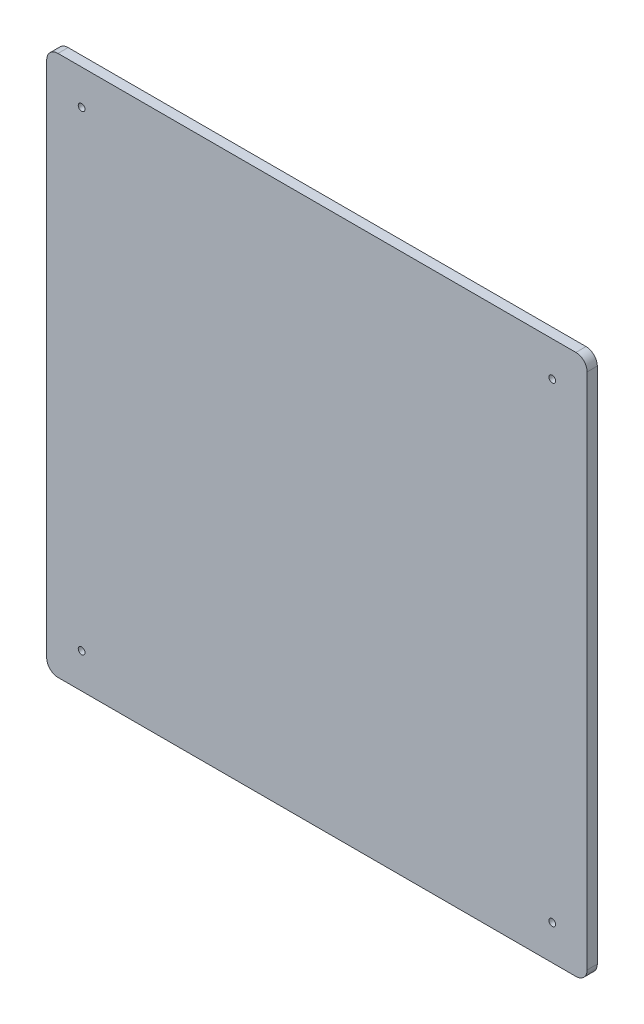
ISO-10303-21;
HEADER;
FILE_DESCRIPTION(('STEP AP214'),'2;1');
FILE_NAME('part.step','',(''),(''),'','','');
FILE_SCHEMA(('AUTOMOTIVE_DESIGN { 1 0 10303 214 1 1 1 1 }'));
ENDSEC;
DATA;
#1=APPLICATION_CONTEXT('core data for automotive mechanical design processes');
#2=APPLICATION_PROTOCOL_DEFINITION('international standard','automotive_design',2000,#1);
#3=PRODUCT_CONTEXT('',#1,'mechanical');
#4=PRODUCT('Part','Part','',(#3));
#5=PRODUCT_RELATED_PRODUCT_CATEGORY('part','',(#4));
#6=PRODUCT_DEFINITION_FORMATION('','',#4);
#7=PRODUCT_DEFINITION_CONTEXT('part definition',#1,'design');
#8=PRODUCT_DEFINITION('design','',#6,#7);
#9=PRODUCT_DEFINITION_SHAPE('','',#8);
#10=(LENGTH_UNIT() NAMED_UNIT(*) SI_UNIT(.MILLI.,.METRE.));
#11=(NAMED_UNIT(*) PLANE_ANGLE_UNIT() SI_UNIT($,.RADIAN.));
#12=(NAMED_UNIT(*) SI_UNIT($,.STERADIAN.) SOLID_ANGLE_UNIT());
#13=UNCERTAINTY_MEASURE_WITH_UNIT(LENGTH_MEASURE(1.E-05),#10,'distance_accuracy_value','');
#14=(GEOMETRIC_REPRESENTATION_CONTEXT(3) GLOBAL_UNCERTAINTY_ASSIGNED_CONTEXT((#13)) GLOBAL_UNIT_ASSIGNED_CONTEXT((#10,
#11,#12)) REPRESENTATION_CONTEXT('',''));
#15=CARTESIAN_POINT('',(0.,0.,0.));
#16=DIRECTION('',(0.,0.,1.));
#17=DIRECTION('',(1.,0.,0.));
#18=AXIS2_PLACEMENT_3D('',#15,#16,#17);
#19=CARTESIAN_POINT('',(120.,-120.,4.5));
#20=DIRECTION('',(-1.,0.,0.));
#21=DIRECTION('',(0.,-1.,0.));
#22=AXIS2_PLACEMENT_3D('',#19,#20,#21);
#23=PLANE('',#22);
#24=DIRECTION('',(0.,1.,0.));
#25=VECTOR('',#24,1.);
#26=CARTESIAN_POINT('',(120.,-120.,0.));
#27=LINE('',#26,#25);
#28=CARTESIAN_POINT('',(120.,-115.,0.));
#29=VERTEX_POINT('',#28);
#30=CARTESIAN_POINT('',(120.,115.,0.));
#31=VERTEX_POINT('',#30);
#32=EDGE_CURVE('E158',#29,#31,#27,.T.);
#33=ORIENTED_EDGE('',*,*,#32,.T.);
#34=DIRECTION('',(0.,0.,-1.));
#35=VECTOR('',#34,1.);
#36=CARTESIAN_POINT('',(120.,115.,4.5));
#37=LINE('',#36,#35);
#38=CARTESIAN_POINT('',(120.,115.,4.5));
#39=VERTEX_POINT('',#38);
#40=EDGE_CURVE('E11',#31,#39,#37,.F.);
#41=ORIENTED_EDGE('',*,*,#40,.T.);
#42=DIRECTION('',(0.,1.,0.));
#43=VECTOR('',#42,1.);
#44=CARTESIAN_POINT('',(120.,-120.,4.5));
#45=LINE('',#44,#43);
#46=CARTESIAN_POINT('',(120.,-115.,4.5));
#47=VERTEX_POINT('',#46);
#48=EDGE_CURVE('E126',#47,#39,#45,.T.);
#49=ORIENTED_EDGE('',*,*,#48,.F.);
#50=DIRECTION('',(0.,0.,-1.));
#51=VECTOR('',#50,1.);
#52=CARTESIAN_POINT('',(120.,-115.,4.5));
#53=LINE('',#52,#51);
#54=EDGE_CURVE('E42',#47,#29,#53,.T.);
#55=ORIENTED_EDGE('',*,*,#54,.T.);
#56=EDGE_LOOP('',(#33,#41,#49,#55));
#57=FACE_BOUND('',#56,.T.);
#58=ADVANCED_FACE('F34',(#57),#23,.F.);
#59=CARTESIAN_POINT('',(-120.,120.,4.5));
#60=DIRECTION('',(0.,-1.,0.));
#61=DIRECTION('',(1.,0.,0.));
#62=AXIS2_PLACEMENT_3D('',#59,#60,#61);
#63=PLANE('',#62);
#64=DIRECTION('',(-1.,0.,0.));
#65=VECTOR('',#64,1.);
#66=CARTESIAN_POINT('',(-120.,120.,0.));
#67=LINE('',#66,#65);
#68=CARTESIAN_POINT('',(115.,120.,0.));
#69=VERTEX_POINT('',#68);
#70=CARTESIAN_POINT('',(-115.,120.,0.));
#71=VERTEX_POINT('',#70);
#72=EDGE_CURVE('E131',#69,#71,#67,.T.);
#73=ORIENTED_EDGE('',*,*,#72,.T.);
#74=DIRECTION('',(0.,0.,-1.));
#75=VECTOR('',#74,1.);
#76=CARTESIAN_POINT('',(-115.,120.,4.5));
#77=LINE('',#76,#75);
#78=CARTESIAN_POINT('',(-115.,120.,4.5));
#79=VERTEX_POINT('',#78);
#80=EDGE_CURVE('E49',#71,#79,#77,.F.);
#81=ORIENTED_EDGE('',*,*,#80,.T.);
#82=DIRECTION('',(-1.,0.,0.));
#83=VECTOR('',#82,1.);
#84=CARTESIAN_POINT('',(-120.,120.,4.5));
#85=LINE('',#84,#83);
#86=CARTESIAN_POINT('',(115.,120.,4.5));
#87=VERTEX_POINT('',#86);
#88=EDGE_CURVE('E129',#87,#79,#85,.T.);
#89=ORIENTED_EDGE('',*,*,#88,.F.);
#90=DIRECTION('',(0.,0.,-1.));
#91=VECTOR('',#90,1.);
#92=CARTESIAN_POINT('',(115.,120.,4.5));
#93=LINE('',#92,#91);
#94=EDGE_CURVE('E150',#87,#69,#93,.T.);
#95=ORIENTED_EDGE('',*,*,#94,.T.);
#96=EDGE_LOOP('',(#73,#81,#89,#95));
#97=FACE_BOUND('',#96,.T.);
#98=ADVANCED_FACE('F221',(#97),#63,.F.);
#99=CARTESIAN_POINT('',(-120.,-120.,4.5));
#100=DIRECTION('',(1.,0.,0.));
#101=DIRECTION('',(0.,1.,0.));
#102=AXIS2_PLACEMENT_3D('',#99,#100,#101);
#103=PLANE('',#102);
#104=DIRECTION('',(0.,-1.,0.));
#105=VECTOR('',#104,1.);
#106=CARTESIAN_POINT('',(-120.,-120.,0.));
#107=LINE('',#106,#105);
#108=CARTESIAN_POINT('',(-120.,115.,0.));
#109=VERTEX_POINT('',#108);
#110=CARTESIAN_POINT('',(-120.,-115.,0.));
#111=VERTEX_POINT('',#110);
#112=EDGE_CURVE('E127',#109,#111,#107,.T.);
#113=ORIENTED_EDGE('',*,*,#112,.T.);
#114=DIRECTION('',(0.,0.,-1.));
#115=VECTOR('',#114,1.);
#116=CARTESIAN_POINT('',(-120.,-115.,4.5));
#117=LINE('',#116,#115);
#118=CARTESIAN_POINT('',(-120.,-115.,4.5));
#119=VERTEX_POINT('',#118);
#120=EDGE_CURVE('E105',#111,#119,#117,.F.);
#121=ORIENTED_EDGE('',*,*,#120,.T.);
#122=DIRECTION('',(0.,-1.,0.));
#123=VECTOR('',#122,1.);
#124=CARTESIAN_POINT('',(-120.,-120.,4.5));
#125=LINE('',#124,#123);
#126=CARTESIAN_POINT('',(-120.,115.,4.5));
#127=VERTEX_POINT('',#126);
#128=EDGE_CURVE('E170',#127,#119,#125,.T.);
#129=ORIENTED_EDGE('',*,*,#128,.F.);
#130=DIRECTION('',(0.,0.,-1.));
#131=VECTOR('',#130,1.);
#132=CARTESIAN_POINT('',(-120.,115.,4.5));
#133=LINE('',#132,#131);
#134=EDGE_CURVE('E110',#127,#109,#133,.T.);
#135=ORIENTED_EDGE('',*,*,#134,.T.);
#136=EDGE_LOOP('',(#113,#121,#129,#135));
#137=FACE_BOUND('',#136,.T.);
#138=ADVANCED_FACE('F218',(#137),#103,.F.);
#139=CARTESIAN_POINT('',(-120.,-120.,4.5));
#140=DIRECTION('',(0.,1.,0.));
#141=DIRECTION('',(-1.,0.,0.));
#142=AXIS2_PLACEMENT_3D('',#139,#140,#141);
#143=PLANE('',#142);
#144=DIRECTION('',(1.,0.,0.));
#145=VECTOR('',#144,1.);
#146=CARTESIAN_POINT('',(-120.,-120.,4.5));
#147=LINE('',#146,#145);
#148=CARTESIAN_POINT('',(-115.,-120.,4.5));
#149=VERTEX_POINT('',#148);
#150=CARTESIAN_POINT('',(115.,-120.,4.5));
#151=VERTEX_POINT('',#150);
#152=EDGE_CURVE('E120',#149,#151,#147,.T.);
#153=ORIENTED_EDGE('',*,*,#152,.F.);
#154=DIRECTION('',(0.,0.,-1.));
#155=VECTOR('',#154,1.);
#156=CARTESIAN_POINT('',(-115.,-120.,4.5));
#157=LINE('',#156,#155);
#158=CARTESIAN_POINT('',(-115.,-120.,0.));
#159=VERTEX_POINT('',#158);
#160=EDGE_CURVE('E104',#149,#159,#157,.T.);
#161=ORIENTED_EDGE('',*,*,#160,.T.);
#162=DIRECTION('',(1.,0.,0.));
#163=VECTOR('',#162,1.);
#164=CARTESIAN_POINT('',(-120.,-120.,0.));
#165=LINE('',#164,#163);
#166=CARTESIAN_POINT('',(115.,-120.,0.));
#167=VERTEX_POINT('',#166);
#168=EDGE_CURVE('E117',#159,#167,#165,.T.);
#169=ORIENTED_EDGE('',*,*,#168,.T.);
#170=DIRECTION('',(0.,0.,-1.));
#171=VECTOR('',#170,1.);
#172=CARTESIAN_POINT('',(115.,-120.,4.5));
#173=LINE('',#172,#171);
#174=EDGE_CURVE('E122',#167,#151,#173,.F.);
#175=ORIENTED_EDGE('',*,*,#174,.T.);
#176=EDGE_LOOP('',(#153,#161,#169,#175));
#177=FACE_BOUND('',#176,.T.);
#178=ADVANCED_FACE('F116',(#177),#143,.F.);
#179=CARTESIAN_POINT('',(0.,0.,4.5));
#180=DIRECTION('',(0.,0.,-1.));
#181=DIRECTION('',(-1.,0.,0.));
#182=AXIS2_PLACEMENT_3D('',#179,#180,#181);
#183=PLANE('',#182);
#184=CARTESIAN_POINT('',(-104.5,104.5,4.5));
#185=DIRECTION('',(0.,0.,-1.));
#186=DIRECTION('',(-1.,0.,0.));
#187=AXIS2_PLACEMENT_3D('',#184,#185,#186);
#188=CIRCLE('',#187,1.5);
#189=CARTESIAN_POINT('',(-106.,104.5,4.5));
#190=VERTEX_POINT('',#189);
#191=EDGE_CURVE('E176',#190,#190,#188,.F.);
#192=ORIENTED_EDGE('',*,*,#191,.F.);
#193=EDGE_LOOP('',(#192));
#194=FACE_BOUND('',#193,.T.);
#195=CARTESIAN_POINT('',(104.5,-104.5,4.5));
#196=DIRECTION('',(0.,0.,-1.));
#197=DIRECTION('',(-1.,0.,0.));
#198=AXIS2_PLACEMENT_3D('',#195,#196,#197);
#199=CIRCLE('',#198,1.5);
#200=CARTESIAN_POINT('',(103.,-104.5,4.5));
#201=VERTEX_POINT('',#200);
#202=EDGE_CURVE('E177',#201,#201,#199,.F.);
#203=ORIENTED_EDGE('',*,*,#202,.F.);
#204=EDGE_LOOP('',(#203));
#205=FACE_BOUND('',#204,.T.);
#206=CARTESIAN_POINT('',(-104.5,-104.5,4.5));
#207=DIRECTION('',(0.,0.,-1.));
#208=DIRECTION('',(-1.,0.,0.));
#209=AXIS2_PLACEMENT_3D('',#206,#207,#208);
#210=CIRCLE('',#209,1.5);
#211=CARTESIAN_POINT('',(-106.,-104.5,4.5));
#212=VERTEX_POINT('',#211);
#213=EDGE_CURVE('E184',#212,#212,#210,.F.);
#214=ORIENTED_EDGE('',*,*,#213,.F.);
#215=EDGE_LOOP('',(#214));
#216=FACE_BOUND('',#215,.T.);
#217=CARTESIAN_POINT('',(104.5,104.5,4.5));
#218=DIRECTION('',(0.,0.,-1.));
#219=DIRECTION('',(-1.,0.,0.));
#220=AXIS2_PLACEMENT_3D('',#217,#218,#219);
#221=CIRCLE('',#220,1.5);
#222=CARTESIAN_POINT('',(103.,104.5,4.5));
#223=VERTEX_POINT('',#222);
#224=EDGE_CURVE('E163',#223,#223,#221,.F.);
#225=ORIENTED_EDGE('',*,*,#224,.F.);
#226=EDGE_LOOP('',(#225));
#227=FACE_BOUND('',#226,.T.);
#228=ORIENTED_EDGE('',*,*,#128,.T.);
#229=CARTESIAN_POINT('',(-115.,-115.,4.5));
#230=DIRECTION('',(0.,0.,-1.));
#231=DIRECTION('',(-1.,0.,0.));
#232=AXIS2_PLACEMENT_3D('',#229,#230,#231);
#233=CIRCLE('',#232,5.);
#234=EDGE_CURVE('E148',#119,#149,#233,.F.);
#235=ORIENTED_EDGE('',*,*,#234,.T.);
#236=ORIENTED_EDGE('',*,*,#152,.T.);
#237=CARTESIAN_POINT('',(115.,-115.,4.5));
#238=DIRECTION('',(0.,0.,-1.));
#239=DIRECTION('',(-1.,0.,0.));
#240=AXIS2_PLACEMENT_3D('',#237,#238,#239);
#241=CIRCLE('',#240,5.);
#242=EDGE_CURVE('E143',#151,#47,#241,.F.);
#243=ORIENTED_EDGE('',*,*,#242,.T.);
#244=ORIENTED_EDGE('',*,*,#48,.T.);
#245=CARTESIAN_POINT('',(115.,115.,4.5));
#246=DIRECTION('',(0.,0.,-1.));
#247=DIRECTION('',(-1.,0.,0.));
#248=AXIS2_PLACEMENT_3D('',#245,#246,#247);
#249=CIRCLE('',#248,5.);
#250=EDGE_CURVE('E56',#39,#87,#249,.F.);
#251=ORIENTED_EDGE('',*,*,#250,.T.);
#252=ORIENTED_EDGE('',*,*,#88,.T.);
#253=CARTESIAN_POINT('',(-115.,115.,4.5));
#254=DIRECTION('',(0.,0.,-1.));
#255=DIRECTION('',(-1.,0.,0.));
#256=AXIS2_PLACEMENT_3D('',#253,#254,#255);
#257=CIRCLE('',#256,5.);
#258=EDGE_CURVE('E146',#79,#127,#257,.F.);
#259=ORIENTED_EDGE('',*,*,#258,.T.);
#260=EDGE_LOOP('',(#228,#235,#236,#243,#244,#251,#252,#259));
#261=FACE_BOUND('',#260,.T.);
#262=ADVANCED_FACE('F201',(#194,#205,#216,#227,#261),#183,.F.);
#263=CARTESIAN_POINT('',(0.,0.,0.));
#264=DIRECTION('',(0.,0.,-1.));
#265=DIRECTION('',(-1.,0.,0.));
#266=AXIS2_PLACEMENT_3D('',#263,#264,#265);
#267=PLANE('',#266);
#268=CARTESIAN_POINT('',(-104.5,104.5,0.));
#269=DIRECTION('',(0.,0.,-1.));
#270=DIRECTION('',(-1.,0.,0.));
#271=AXIS2_PLACEMENT_3D('',#268,#269,#270);
#272=CIRCLE('',#271,1.5);
#273=CARTESIAN_POINT('',(-106.,104.5,0.));
#274=VERTEX_POINT('',#273);
#275=EDGE_CURVE('E180',#274,#274,#272,.T.);
#276=ORIENTED_EDGE('',*,*,#275,.F.);
#277=EDGE_LOOP('',(#276));
#278=FACE_BOUND('',#277,.T.);
#279=CARTESIAN_POINT('',(104.5,-104.5,0.));
#280=DIRECTION('',(0.,0.,-1.));
#281=DIRECTION('',(-1.,0.,0.));
#282=AXIS2_PLACEMENT_3D('',#279,#280,#281);
#283=CIRCLE('',#282,1.5);
#284=CARTESIAN_POINT('',(103.,-104.5,0.));
#285=VERTEX_POINT('',#284);
#286=EDGE_CURVE('E181',#285,#285,#283,.T.);
#287=ORIENTED_EDGE('',*,*,#286,.F.);
#288=EDGE_LOOP('',(#287));
#289=FACE_BOUND('',#288,.T.);
#290=CARTESIAN_POINT('',(-104.5,-104.5,0.));
#291=DIRECTION('',(0.,0.,-1.));
#292=DIRECTION('',(-1.,0.,0.));
#293=AXIS2_PLACEMENT_3D('',#290,#291,#292);
#294=CIRCLE('',#293,1.5);
#295=CARTESIAN_POINT('',(-106.,-104.5,0.));
#296=VERTEX_POINT('',#295);
#297=EDGE_CURVE('E191',#296,#296,#294,.T.);
#298=ORIENTED_EDGE('',*,*,#297,.F.);
#299=EDGE_LOOP('',(#298));
#300=FACE_BOUND('',#299,.T.);
#301=CARTESIAN_POINT('',(104.5,104.5,0.));
#302=DIRECTION('',(0.,0.,-1.));
#303=DIRECTION('',(-1.,0.,0.));
#304=AXIS2_PLACEMENT_3D('',#301,#302,#303);
#305=CIRCLE('',#304,1.5);
#306=CARTESIAN_POINT('',(103.,104.5,0.));
#307=VERTEX_POINT('',#306);
#308=EDGE_CURVE('E166',#307,#307,#305,.T.);
#309=ORIENTED_EDGE('',*,*,#308,.F.);
#310=EDGE_LOOP('',(#309));
#311=FACE_BOUND('',#310,.T.);
#312=ORIENTED_EDGE('',*,*,#168,.F.);
#313=CARTESIAN_POINT('',(-115.,-115.,0.));
#314=DIRECTION('',(0.,0.,-1.));
#315=DIRECTION('',(-1.,0.,0.));
#316=AXIS2_PLACEMENT_3D('',#313,#314,#315);
#317=CIRCLE('',#316,5.);
#318=EDGE_CURVE('E100',#159,#111,#317,.T.);
#319=ORIENTED_EDGE('',*,*,#318,.T.);
#320=ORIENTED_EDGE('',*,*,#112,.F.);
#321=CARTESIAN_POINT('',(-115.,115.,0.));
#322=DIRECTION('',(0.,0.,-1.));
#323=DIRECTION('',(-1.,0.,0.));
#324=AXIS2_PLACEMENT_3D('',#321,#322,#323);
#325=CIRCLE('',#324,5.);
#326=EDGE_CURVE('E111',#109,#71,#325,.T.);
#327=ORIENTED_EDGE('',*,*,#326,.T.);
#328=ORIENTED_EDGE('',*,*,#72,.F.);
#329=CARTESIAN_POINT('',(115.,115.,0.));
#330=DIRECTION('',(0.,0.,-1.));
#331=DIRECTION('',(-1.,0.,0.));
#332=AXIS2_PLACEMENT_3D('',#329,#330,#331);
#333=CIRCLE('',#332,5.);
#334=EDGE_CURVE('E137',#69,#31,#333,.T.);
#335=ORIENTED_EDGE('',*,*,#334,.T.);
#336=ORIENTED_EDGE('',*,*,#32,.F.);
#337=CARTESIAN_POINT('',(115.,-115.,0.));
#338=DIRECTION('',(0.,0.,-1.));
#339=DIRECTION('',(-1.,0.,0.));
#340=AXIS2_PLACEMENT_3D('',#337,#338,#339);
#341=CIRCLE('',#340,5.);
#342=EDGE_CURVE('E121',#29,#167,#341,.T.);
#343=ORIENTED_EDGE('',*,*,#342,.T.);
#344=EDGE_LOOP('',(#312,#319,#320,#327,#328,#335,#336,#343));
#345=FACE_BOUND('',#344,.T.);
#346=ADVANCED_FACE('F124',(#278,#289,#300,#311,#345),#267,.T.);
#347=CARTESIAN_POINT('',(104.5,104.5,4.501));
#348=DIRECTION('',(0.,0.,-1.));
#349=DIRECTION('',(-1.,0.,0.));
#350=AXIS2_PLACEMENT_3D('',#347,#348,#349);
#351=CYLINDRICAL_SURFACE('',#350,1.5);
#352=ORIENTED_EDGE('',*,*,#308,.T.);
#353=EDGE_LOOP('',(#352));
#354=FACE_BOUND('',#353,.T.);
#355=ORIENTED_EDGE('',*,*,#224,.T.);
#356=EDGE_LOOP('',(#355));
#357=FACE_BOUND('',#356,.T.);
#358=ADVANCED_FACE('F200',(#354,#357),#351,.F.);
#359=CARTESIAN_POINT('',(-104.5,-104.5,4.501));
#360=DIRECTION('',(0.,0.,-1.));
#361=DIRECTION('',(-1.,0.,0.));
#362=AXIS2_PLACEMENT_3D('',#359,#360,#361);
#363=CYLINDRICAL_SURFACE('',#362,1.5);
#364=ORIENTED_EDGE('',*,*,#297,.T.);
#365=EDGE_LOOP('',(#364));
#366=FACE_BOUND('',#365,.T.);
#367=ORIENTED_EDGE('',*,*,#213,.T.);
#368=EDGE_LOOP('',(#367));
#369=FACE_BOUND('',#368,.T.);
#370=ADVANCED_FACE('F195',(#366,#369),#363,.F.);
#371=CARTESIAN_POINT('',(104.5,-104.5,4.501));
#372=DIRECTION('',(0.,0.,-1.));
#373=DIRECTION('',(-1.,0.,0.));
#374=AXIS2_PLACEMENT_3D('',#371,#372,#373);
#375=CYLINDRICAL_SURFACE('',#374,1.5);
#376=ORIENTED_EDGE('',*,*,#286,.T.);
#377=EDGE_LOOP('',(#376));
#378=FACE_BOUND('',#377,.T.);
#379=ORIENTED_EDGE('',*,*,#202,.T.);
#380=EDGE_LOOP('',(#379));
#381=FACE_BOUND('',#380,.T.);
#382=ADVANCED_FACE('F277',(#378,#381),#375,.F.);
#383=CARTESIAN_POINT('',(-104.5,104.5,4.501));
#384=DIRECTION('',(0.,0.,-1.));
#385=DIRECTION('',(-1.,0.,0.));
#386=AXIS2_PLACEMENT_3D('',#383,#384,#385);
#387=CYLINDRICAL_SURFACE('',#386,1.5);
#388=ORIENTED_EDGE('',*,*,#275,.T.);
#389=EDGE_LOOP('',(#388));
#390=FACE_BOUND('',#389,.T.);
#391=ORIENTED_EDGE('',*,*,#191,.T.);
#392=EDGE_LOOP('',(#391));
#393=FACE_BOUND('',#392,.T.);
#394=ADVANCED_FACE('F239',(#390,#393),#387,.F.);
#395=CARTESIAN_POINT('',(-115.,-115.,4.5));
#396=DIRECTION('',(0.,0.,-1.));
#397=DIRECTION('',(-1.,0.,0.));
#398=AXIS2_PLACEMENT_3D('',#395,#396,#397);
#399=CYLINDRICAL_SURFACE('',#398,5.);
#400=ORIENTED_EDGE('',*,*,#234,.F.);
#401=ORIENTED_EDGE('',*,*,#120,.F.);
#402=ORIENTED_EDGE('',*,*,#318,.F.);
#403=ORIENTED_EDGE('',*,*,#160,.F.);
#404=EDGE_LOOP('',(#400,#401,#402,#403));
#405=FACE_BOUND('',#404,.T.);
#406=ADVANCED_FACE('F103',(#405),#399,.T.);
#407=CARTESIAN_POINT('',(-115.,115.,4.5));
#408=DIRECTION('',(0.,0.,-1.));
#409=DIRECTION('',(-1.,0.,0.));
#410=AXIS2_PLACEMENT_3D('',#407,#408,#409);
#411=CYLINDRICAL_SURFACE('',#410,5.);
#412=ORIENTED_EDGE('',*,*,#258,.F.);
#413=ORIENTED_EDGE('',*,*,#80,.F.);
#414=ORIENTED_EDGE('',*,*,#326,.F.);
#415=ORIENTED_EDGE('',*,*,#134,.F.);
#416=EDGE_LOOP('',(#412,#413,#414,#415));
#417=FACE_BOUND('',#416,.T.);
#418=ADVANCED_FACE('F220',(#417),#411,.T.);
#419=CARTESIAN_POINT('',(115.,115.,4.5));
#420=DIRECTION('',(0.,0.,-1.));
#421=DIRECTION('',(-1.,0.,0.));
#422=AXIS2_PLACEMENT_3D('',#419,#420,#421);
#423=CYLINDRICAL_SURFACE('',#422,5.);
#424=ORIENTED_EDGE('',*,*,#250,.F.);
#425=ORIENTED_EDGE('',*,*,#40,.F.);
#426=ORIENTED_EDGE('',*,*,#334,.F.);
#427=ORIENTED_EDGE('',*,*,#94,.F.);
#428=EDGE_LOOP('',(#424,#425,#426,#427));
#429=FACE_BOUND('',#428,.T.);
#430=ADVANCED_FACE('F224',(#429),#423,.T.);
#431=CARTESIAN_POINT('',(115.,-115.,4.5));
#432=DIRECTION('',(0.,0.,-1.));
#433=DIRECTION('',(-1.,0.,0.));
#434=AXIS2_PLACEMENT_3D('',#431,#432,#433);
#435=CYLINDRICAL_SURFACE('',#434,5.);
#436=ORIENTED_EDGE('',*,*,#242,.F.);
#437=ORIENTED_EDGE('',*,*,#174,.F.);
#438=ORIENTED_EDGE('',*,*,#342,.F.);
#439=ORIENTED_EDGE('',*,*,#54,.F.);
#440=EDGE_LOOP('',(#436,#437,#438,#439));
#441=FACE_BOUND('',#440,.T.);
#442=ADVANCED_FACE('F36',(#441),#435,.T.);
#443=CLOSED_SHELL('',(#58,#98,#138,#178,#262,#346,#358,#370,#382,#394,#406,#418,#430,#442));
#444=MANIFOLD_SOLID_BREP('B2',#443);
#445=ADVANCED_BREP_SHAPE_REPRESENTATION('',(#18,#444),#14);
#446=SHAPE_DEFINITION_REPRESENTATION(#9,#445);
ENDSEC;
END-ISO-10303-21;
